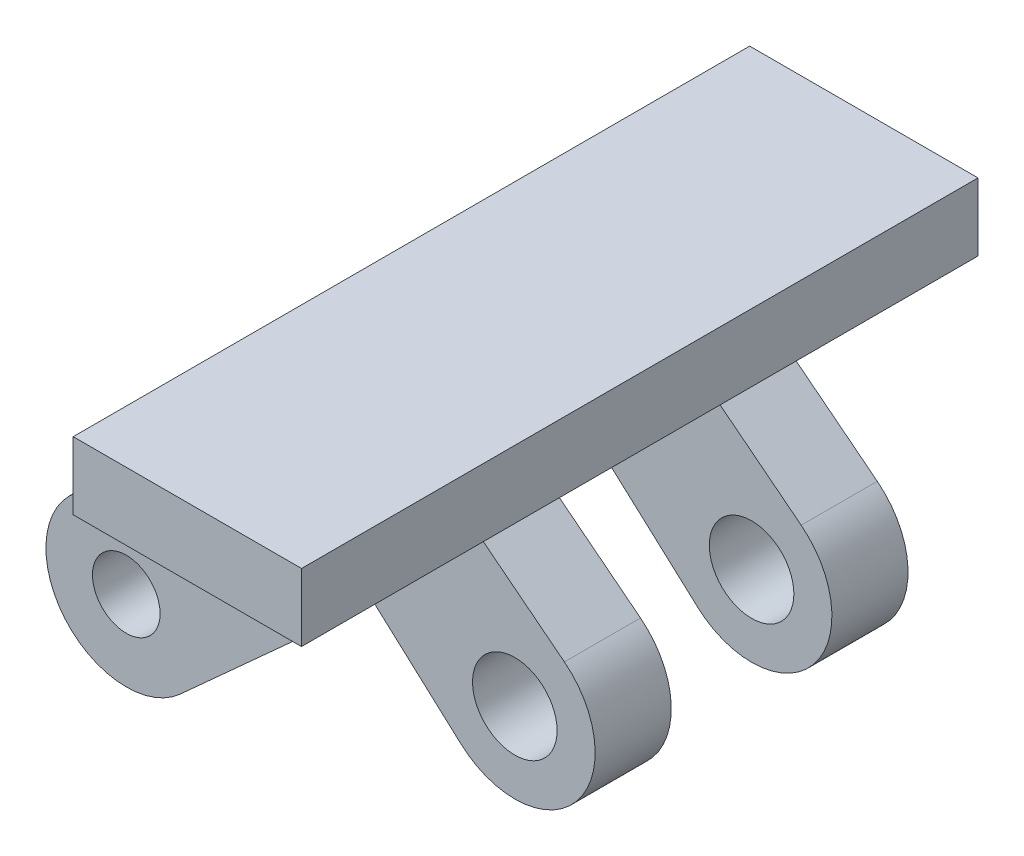
ISO-10303-21;
HEADER;
FILE_DESCRIPTION(('STEP AP214'),'2;1');
FILE_NAME('part.step','',(''),(''),'','','');
FILE_SCHEMA(('AUTOMOTIVE_DESIGN { 1 0 10303 214 1 1 1 1 }'));
ENDSEC;
DATA;
#1=APPLICATION_CONTEXT('core data for automotive mechanical design processes');
#2=APPLICATION_PROTOCOL_DEFINITION('international standard','automotive_design',2000,#1);
#3=PRODUCT_CONTEXT('',#1,'mechanical');
#4=PRODUCT('Part','Part','',(#3));
#5=PRODUCT_RELATED_PRODUCT_CATEGORY('part','',(#4));
#6=PRODUCT_DEFINITION_FORMATION('','',#4);
#7=PRODUCT_DEFINITION_CONTEXT('part definition',#1,'design');
#8=PRODUCT_DEFINITION('design','',#6,#7);
#9=PRODUCT_DEFINITION_SHAPE('','',#8);
#10=(LENGTH_UNIT() NAMED_UNIT(*) SI_UNIT(.MILLI.,.METRE.));
#11=(NAMED_UNIT(*) PLANE_ANGLE_UNIT() SI_UNIT($,.RADIAN.));
#12=(NAMED_UNIT(*) SI_UNIT($,.STERADIAN.) SOLID_ANGLE_UNIT());
#13=UNCERTAINTY_MEASURE_WITH_UNIT(LENGTH_MEASURE(1.E-05),#10,'distance_accuracy_value','');
#14=(GEOMETRIC_REPRESENTATION_CONTEXT(3) GLOBAL_UNCERTAINTY_ASSIGNED_CONTEXT((#13)) GLOBAL_UNIT_ASSIGNED_CONTEXT((#10,
#11,#12)) REPRESENTATION_CONTEXT('',''));
#15=CARTESIAN_POINT('',(0.,0.,0.));
#16=DIRECTION('',(0.,0.,1.));
#17=DIRECTION('',(1.,0.,0.));
#18=AXIS2_PLACEMENT_3D('',#15,#16,#17);
#19=CARTESIAN_POINT('',(0.,-1.6,-8.));
#20=DIRECTION('',(0.,-1.,0.));
#21=DIRECTION('',(0.,0.,-1.));
#22=AXIS2_PLACEMENT_3D('',#19,#20,#21);
#23=PLANE('',#22);
#24=DIRECTION('',(0.,0.,1.));
#25=VECTOR('',#24,1.);
#26=CARTESIAN_POINT('',(0.,-1.6,-8.));
#27=LINE('',#26,#25);
#28=CARTESIAN_POINT('',(0.,-1.6,-1.9));
#29=VERTEX_POINT('',#28);
#30=CARTESIAN_POINT('',(0.,-1.6,1.9));
#31=VERTEX_POINT('',#30);
#32=EDGE_CURVE('E59',#29,#31,#27,.T.);
#33=ORIENTED_EDGE('',*,*,#32,.F.);
#34=DIRECTION('',(1.,0.,0.));
#35=VECTOR('',#34,1.);
#36=CARTESIAN_POINT('',(0.,-1.6,-1.9));
#37=LINE('',#36,#35);
#38=CARTESIAN_POINT('',(5.4,-1.6,-1.9));
#39=VERTEX_POINT('',#38);
#40=EDGE_CURVE('E195',#29,#39,#37,.T.);
#41=ORIENTED_EDGE('',*,*,#40,.T.);
#42=DIRECTION('',(0.,0.,1.));
#43=VECTOR('',#42,1.);
#44=CARTESIAN_POINT('',(5.4,-1.6,-8.));
#45=LINE('',#44,#43);
#46=CARTESIAN_POINT('',(5.4,-1.6,1.9));
#47=VERTEX_POINT('',#46);
#48=EDGE_CURVE('E179',#39,#47,#45,.T.);
#49=ORIENTED_EDGE('',*,*,#48,.T.);
#50=DIRECTION('',(1.,0.,0.));
#51=VECTOR('',#50,1.);
#52=CARTESIAN_POINT('',(0.,-1.6,1.9));
#53=LINE('',#52,#51);
#54=EDGE_CURVE('E284',#31,#47,#53,.T.);
#55=ORIENTED_EDGE('',*,*,#54,.F.);
#56=EDGE_LOOP('',(#33,#41,#49,#55));
#57=FACE_BOUND('',#56,.T.);
#58=ADVANCED_FACE('F41',(#57),#23,.T.);
#59=DIRECTION('',(1.,0.,0.));
#60=VECTOR('',#59,1.);
#61=CARTESIAN_POINT('',(0.,-1.6,-3.7));
#62=LINE('',#61,#60);
#63=CARTESIAN_POINT('',(0.,-1.6,-3.7));
#64=VERTEX_POINT('',#63);
#65=CARTESIAN_POINT('',(5.4,-1.6,-3.7));
#66=VERTEX_POINT('',#65);
#67=EDGE_CURVE('E68',#64,#66,#62,.T.);
#68=ORIENTED_EDGE('',*,*,#67,.F.);
#69=CARTESIAN_POINT('',(0.,-1.6,-4.));
#70=VERTEX_POINT('',#69);
#71=EDGE_CURVE('E379',#70,#64,#27,.T.);
#72=ORIENTED_EDGE('',*,*,#71,.F.);
#73=DIRECTION('',(1.,0.,0.));
#74=VECTOR('',#73,1.);
#75=CARTESIAN_POINT('',(0.,-1.6,-4.));
#76=LINE('',#75,#74);
#77=CARTESIAN_POINT('',(5.4,-1.6,-4.));
#78=VERTEX_POINT('',#77);
#79=EDGE_CURVE('E239',#70,#78,#76,.T.);
#80=ORIENTED_EDGE('',*,*,#79,.T.);
#81=EDGE_CURVE('E189',#78,#66,#45,.T.);
#82=ORIENTED_EDGE('',*,*,#81,.T.);
#83=EDGE_LOOP('',(#68,#72,#80,#82));
#84=FACE_BOUND('',#83,.T.);
#85=ADVANCED_FACE('F430',(#84),#23,.T.);
#86=DIRECTION('',(1.,0.,0.));
#87=VECTOR('',#86,1.);
#88=CARTESIAN_POINT('',(0.,-1.6,-6.));
#89=LINE('',#88,#87);
#90=CARTESIAN_POINT('',(0.,-1.6,-6.));
#91=VERTEX_POINT('',#90);
#92=CARTESIAN_POINT('',(5.4,-1.6,-6.));
#93=VERTEX_POINT('',#92);
#94=EDGE_CURVE('E253',#91,#93,#89,.T.);
#95=ORIENTED_EDGE('',*,*,#94,.F.);
#96=CARTESIAN_POINT('',(0.,-1.6,-8.));
#97=VERTEX_POINT('',#96);
#98=EDGE_CURVE('E44',#97,#91,#27,.T.);
#99=ORIENTED_EDGE('',*,*,#98,.F.);
#100=DIRECTION('',(1.,0.,0.));
#101=VECTOR('',#100,1.);
#102=CARTESIAN_POINT('',(0.,-1.6,-8.));
#103=LINE('',#102,#101);
#104=CARTESIAN_POINT('',(5.4,-1.6,-8.));
#105=VERTEX_POINT('',#104);
#106=EDGE_CURVE('E365',#97,#105,#103,.T.);
#107=ORIENTED_EDGE('',*,*,#106,.T.);
#108=EDGE_CURVE('E188',#105,#93,#45,.T.);
#109=ORIENTED_EDGE('',*,*,#108,.T.);
#110=EDGE_LOOP('',(#95,#99,#107,#109));
#111=FACE_BOUND('',#110,.T.);
#112=ADVANCED_FACE('F435',(#111),#23,.T.);
#113=CARTESIAN_POINT('',(0.,-1.6,6.));
#114=VERTEX_POINT('',#113);
#115=CARTESIAN_POINT('',(0.,-1.6,8.));
#116=VERTEX_POINT('',#115);
#117=EDGE_CURVE('E369',#114,#116,#27,.T.);
#118=ORIENTED_EDGE('',*,*,#117,.F.);
#119=DIRECTION('',(1.,0.,0.));
#120=VECTOR('',#119,1.);
#121=CARTESIAN_POINT('',(0.,-1.6,6.));
#122=LINE('',#121,#120);
#123=CARTESIAN_POINT('',(5.4,-1.6,6.));
#124=VERTEX_POINT('',#123);
#125=EDGE_CURVE('E334',#114,#124,#122,.T.);
#126=ORIENTED_EDGE('',*,*,#125,.T.);
#127=CARTESIAN_POINT('',(5.4,-1.6,8.));
#128=VERTEX_POINT('',#127);
#129=EDGE_CURVE('E373',#124,#128,#45,.T.);
#130=ORIENTED_EDGE('',*,*,#129,.T.);
#131=DIRECTION('',(1.,0.,0.));
#132=VECTOR('',#131,1.);
#133=CARTESIAN_POINT('',(0.,-1.6,8.));
#134=LINE('',#133,#132);
#135=EDGE_CURVE('E349',#116,#128,#134,.T.);
#136=ORIENTED_EDGE('',*,*,#135,.F.);
#137=EDGE_LOOP('',(#118,#126,#130,#136));
#138=FACE_BOUND('',#137,.T.);
#139=ADVANCED_FACE('F413',(#138),#23,.T.);
#140=CARTESIAN_POINT('',(0.,0.,-8.));
#141=DIRECTION('',(-1.,0.,0.));
#142=DIRECTION('',(0.,-1.,0.));
#143=AXIS2_PLACEMENT_3D('',#140,#141,#142);
#144=PLANE('',#143);
#145=ORIENTED_EDGE('',*,*,#98,.T.);
#146=DIRECTION('',(0.,0.,-1.));
#147=VECTOR('',#146,1.);
#148=CARTESIAN_POINT('',(0.,-1.6,-4.));
#149=LINE('',#148,#147);
#150=EDGE_CURVE('E255',#70,#91,#149,.T.);
#151=ORIENTED_EDGE('',*,*,#150,.F.);
#152=ORIENTED_EDGE('',*,*,#71,.T.);
#153=DIRECTION('',(0.,0.,-1.));
#154=VECTOR('',#153,1.);
#155=CARTESIAN_POINT('',(0.,-1.6,-1.9));
#156=LINE('',#155,#154);
#157=EDGE_CURVE('E207',#29,#64,#156,.T.);
#158=ORIENTED_EDGE('',*,*,#157,.F.);
#159=ORIENTED_EDGE('',*,*,#32,.T.);
#160=DIRECTION('',(0.,0.,1.));
#161=VECTOR('',#160,1.);
#162=CARTESIAN_POINT('',(0.,-1.6,1.9));
#163=LINE('',#162,#161);
#164=CARTESIAN_POINT('',(0.,-1.6,3.7));
#165=VERTEX_POINT('',#164);
#166=EDGE_CURVE('E303',#31,#165,#163,.T.);
#167=ORIENTED_EDGE('',*,*,#166,.T.);
#168=CARTESIAN_POINT('',(0.,-1.6,4.));
#169=VERTEX_POINT('',#168);
#170=EDGE_CURVE('E384',#165,#169,#27,.T.);
#171=ORIENTED_EDGE('',*,*,#170,.T.);
#172=DIRECTION('',(0.,0.,1.));
#173=VECTOR('',#172,1.);
#174=CARTESIAN_POINT('',(0.,-1.6,4.));
#175=LINE('',#174,#173);
#176=EDGE_CURVE('E336',#169,#114,#175,.T.);
#177=ORIENTED_EDGE('',*,*,#176,.T.);
#178=ORIENTED_EDGE('',*,*,#117,.T.);
#179=DIRECTION('',(0.,-1.,0.));
#180=VECTOR('',#179,1.);
#181=CARTESIAN_POINT('',(0.,0.,8.));
#182=LINE('',#181,#180);
#183=CARTESIAN_POINT('',(0.,0.,8.));
#184=VERTEX_POINT('',#183);
#185=EDGE_CURVE('E342',#184,#116,#182,.T.);
#186=ORIENTED_EDGE('',*,*,#185,.F.);
#187=DIRECTION('',(0.,0.,1.));
#188=VECTOR('',#187,1.);
#189=CARTESIAN_POINT('',(0.,0.,-8.));
#190=LINE('',#189,#188);
#191=CARTESIAN_POINT('',(0.,0.,-8.));
#192=VERTEX_POINT('',#191);
#193=EDGE_CURVE('E11',#192,#184,#190,.T.);
#194=ORIENTED_EDGE('',*,*,#193,.F.);
#195=DIRECTION('',(0.,-1.,0.));
#196=VECTOR('',#195,1.);
#197=CARTESIAN_POINT('',(0.,0.,-8.));
#198=LINE('',#197,#196);
#199=EDGE_CURVE('E360',#192,#97,#198,.T.);
#200=ORIENTED_EDGE('',*,*,#199,.T.);
#201=EDGE_LOOP('',(#145,#151,#152,#158,#159,#167,#171,#177,#178,#186,#194,#200));
#202=FACE_BOUND('',#201,.T.);
#203=ADVANCED_FACE('F43',(#202),#144,.T.);
#204=CARTESIAN_POINT('',(0.,0.,-8.));
#205=DIRECTION('',(0.,1.,0.));
#206=DIRECTION('',(0.,0.,1.));
#207=AXIS2_PLACEMENT_3D('',#204,#205,#206);
#208=PLANE('',#207);
#209=ORIENTED_EDGE('',*,*,#193,.T.);
#210=DIRECTION('',(-1.,0.,0.));
#211=VECTOR('',#210,1.);
#212=CARTESIAN_POINT('',(0.,0.,8.));
#213=LINE('',#212,#211);
#214=CARTESIAN_POINT('',(5.4,0.,8.));
#215=VERTEX_POINT('',#214);
#216=EDGE_CURVE('E358',#215,#184,#213,.T.);
#217=ORIENTED_EDGE('',*,*,#216,.F.);
#218=DIRECTION('',(0.,0.,1.));
#219=VECTOR('',#218,1.);
#220=CARTESIAN_POINT('',(5.4,0.,-8.));
#221=LINE('',#220,#219);
#222=CARTESIAN_POINT('',(5.4,0.,-8.));
#223=VERTEX_POINT('',#222);
#224=EDGE_CURVE('E49',#223,#215,#221,.T.);
#225=ORIENTED_EDGE('',*,*,#224,.F.);
#226=DIRECTION('',(-1.,0.,0.));
#227=VECTOR('',#226,1.);
#228=CARTESIAN_POINT('',(0.,0.,-8.));
#229=LINE('',#228,#227);
#230=EDGE_CURVE('E368',#223,#192,#229,.T.);
#231=ORIENTED_EDGE('',*,*,#230,.T.);
#232=EDGE_LOOP('',(#209,#217,#225,#231));
#233=FACE_BOUND('',#232,.T.);
#234=ADVANCED_FACE('F443',(#233),#208,.T.);
#235=CARTESIAN_POINT('',(5.4,0.,-8.));
#236=DIRECTION('',(1.,0.,0.));
#237=DIRECTION('',(0.,0.,-1.));
#238=AXIS2_PLACEMENT_3D('',#235,#236,#237);
#239=PLANE('',#238);
#240=ORIENTED_EDGE('',*,*,#224,.T.);
#241=DIRECTION('',(0.,1.,0.));
#242=VECTOR('',#241,1.);
#243=CARTESIAN_POINT('',(5.4,0.,8.));
#244=LINE('',#243,#242);
#245=EDGE_CURVE('E355',#128,#215,#244,.T.);
#246=ORIENTED_EDGE('',*,*,#245,.F.);
#247=ORIENTED_EDGE('',*,*,#129,.F.);
#248=DIRECTION('',(0.,0.,1.));
#249=VECTOR('',#248,1.);
#250=CARTESIAN_POINT('',(5.4,-1.6,4.));
#251=LINE('',#250,#249);
#252=CARTESIAN_POINT('',(5.4,-1.6,4.));
#253=VERTEX_POINT('',#252);
#254=EDGE_CURVE('E345',#253,#124,#251,.T.);
#255=ORIENTED_EDGE('',*,*,#254,.F.);
#256=CARTESIAN_POINT('',(5.4,-1.6,3.7));
#257=VERTEX_POINT('',#256);
#258=EDGE_CURVE('E186',#257,#253,#45,.T.);
#259=ORIENTED_EDGE('',*,*,#258,.F.);
#260=DIRECTION('',(0.,0.,1.));
#261=VECTOR('',#260,1.);
#262=CARTESIAN_POINT('',(5.4,-1.6,1.9));
#263=LINE('',#262,#261);
#264=EDGE_CURVE('E187',#47,#257,#263,.T.);
#265=ORIENTED_EDGE('',*,*,#264,.F.);
#266=ORIENTED_EDGE('',*,*,#48,.F.);
#267=DIRECTION('',(0.,0.,-1.));
#268=VECTOR('',#267,1.);
#269=CARTESIAN_POINT('',(5.4,-1.6,-1.9));
#270=LINE('',#269,#268);
#271=EDGE_CURVE('E182',#39,#66,#270,.T.);
#272=ORIENTED_EDGE('',*,*,#271,.T.);
#273=ORIENTED_EDGE('',*,*,#81,.F.);
#274=DIRECTION('',(0.,0.,-1.));
#275=VECTOR('',#274,1.);
#276=CARTESIAN_POINT('',(5.4,-1.6,-4.));
#277=LINE('',#276,#275);
#278=EDGE_CURVE('E275',#78,#93,#277,.T.);
#279=ORIENTED_EDGE('',*,*,#278,.T.);
#280=ORIENTED_EDGE('',*,*,#108,.F.);
#281=DIRECTION('',(0.,1.,0.));
#282=VECTOR('',#281,1.);
#283=CARTESIAN_POINT('',(5.4,0.,-8.));
#284=LINE('',#283,#282);
#285=EDGE_CURVE('E362',#105,#223,#284,.T.);
#286=ORIENTED_EDGE('',*,*,#285,.T.);
#287=EDGE_LOOP('',(#240,#246,#247,#255,#259,#265,#266,#272,#273,#279,#280,#286));
#288=FACE_BOUND('',#287,.T.);
#289=ADVANCED_FACE('F181',(#288),#239,.T.);
#290=DIRECTION('',(1.,0.,0.));
#291=VECTOR('',#290,1.);
#292=CARTESIAN_POINT('',(0.,-1.6,3.7));
#293=LINE('',#292,#291);
#294=EDGE_CURVE('E299',#165,#257,#293,.T.);
#295=ORIENTED_EDGE('',*,*,#294,.T.);
#296=ORIENTED_EDGE('',*,*,#258,.T.);
#297=DIRECTION('',(1.,0.,0.));
#298=VECTOR('',#297,1.);
#299=CARTESIAN_POINT('',(0.,-1.6,4.));
#300=LINE('',#299,#298);
#301=EDGE_CURVE('E316',#169,#253,#300,.T.);
#302=ORIENTED_EDGE('',*,*,#301,.F.);
#303=ORIENTED_EDGE('',*,*,#170,.F.);
#304=EDGE_LOOP('',(#295,#296,#302,#303));
#305=FACE_BOUND('',#304,.T.);
#306=ADVANCED_FACE('F395',(#305),#23,.T.);
#307=CARTESIAN_POINT('',(0.,0.,-8.));
#308=DIRECTION('',(0.,0.,1.));
#309=DIRECTION('',(1.,0.,0.));
#310=AXIS2_PLACEMENT_3D('',#307,#308,#309);
#311=PLANE('',#310);
#312=ORIENTED_EDGE('',*,*,#199,.F.);
#313=ORIENTED_EDGE('',*,*,#230,.F.);
#314=ORIENTED_EDGE('',*,*,#285,.F.);
#315=ORIENTED_EDGE('',*,*,#106,.F.);
#316=EDGE_LOOP('',(#312,#313,#314,#315));
#317=FACE_BOUND('',#316,.T.);
#318=ADVANCED_FACE('F434',(#317),#311,.F.);
#319=CARTESIAN_POINT('',(0.,0.,8.));
#320=DIRECTION('',(0.,0.,1.));
#321=DIRECTION('',(1.,0.,0.));
#322=AXIS2_PLACEMENT_3D('',#319,#320,#321);
#323=PLANE('',#322);
#324=ORIENTED_EDGE('',*,*,#185,.T.);
#325=ORIENTED_EDGE('',*,*,#135,.T.);
#326=ORIENTED_EDGE('',*,*,#245,.T.);
#327=ORIENTED_EDGE('',*,*,#216,.T.);
#328=EDGE_LOOP('',(#324,#325,#326,#327));
#329=FACE_BOUND('',#328,.T.);
#330=ADVANCED_FACE('F421',(#329),#323,.T.);
#331=CARTESIAN_POINT('',(0.777081399717918,-0.990117064495644,4.));
#332=DIRECTION('',(-0.617395201382569,0.786653141676671,0.));
#333=DIRECTION('',(-0.786653141676671,-0.617395201382569,0.));
#334=AXIS2_PLACEMENT_3D('',#331,#332,#333);
#335=PLANE('',#334);
#336=DIRECTION('',(-0.786653141676672,-0.617395201382569,0.));
#337=VECTOR('',#336,1.);
#338=CARTESIAN_POINT('',(0.777081399717918,-0.990117064495644,6.));
#339=LINE('',#338,#337);
#340=CARTESIAN_POINT('',(-1.91805088262688,-3.10535903081433,6.));
#341=VERTEX_POINT('',#340);
#342=EDGE_CURVE('E304',#114,#341,#339,.T.);
#343=ORIENTED_EDGE('',*,*,#342,.F.);
#344=ORIENTED_EDGE('',*,*,#176,.F.);
#345=DIRECTION('',(-0.786653141676672,-0.617395201382569,0.));
#346=VECTOR('',#345,1.);
#347=CARTESIAN_POINT('',(0.777081399717918,-0.990117064495644,4.));
#348=LINE('',#347,#346);
#349=CARTESIAN_POINT('',(-1.91805088262688,-3.10535903081433,4.));
#350=VERTEX_POINT('',#349);
#351=EDGE_CURVE('E309',#169,#350,#348,.T.);
#352=ORIENTED_EDGE('',*,*,#351,.T.);
#353=DIRECTION('',(0.,0.,1.));
#354=VECTOR('',#353,1.);
#355=CARTESIAN_POINT('',(-1.91805088262688,-3.10535903081433,4.));
#356=LINE('',#355,#354);
#357=EDGE_CURVE('E323',#350,#341,#356,.T.);
#358=ORIENTED_EDGE('',*,*,#357,.T.);
#359=EDGE_LOOP('',(#343,#344,#352,#358));
#360=FACE_BOUND('',#359,.T.);
#361=ADVANCED_FACE('F399',(#360),#335,.T.);
#362=CARTESIAN_POINT('',(3.22823705745536,-3.56603789040044,4.));
#363=DIRECTION('',(-0.671121557689838,0.741347324001352,0.));
#364=DIRECTION('',(-0.741347324001352,-0.671121557689838,0.));
#365=AXIS2_PLACEMENT_3D('',#362,#363,#364);
#366=PLANE('',#365);
#367=DIRECTION('',(-0.741347324001352,-0.671121557689838,0.));
#368=VECTOR('',#367,1.);
#369=CARTESIAN_POINT('',(3.22823705745536,-3.56603789040044,6.));
#370=LINE('',#369,#368);
#371=CARTESIAN_POINT('',(0.530130959610694,-6.00855991560257,6.));
#372=VERTEX_POINT('',#371);
#373=EDGE_CURVE('E333',#124,#372,#370,.T.);
#374=ORIENTED_EDGE('',*,*,#373,.T.);
#375=DIRECTION('',(0.,0.,1.));
#376=VECTOR('',#375,1.);
#377=CARTESIAN_POINT('',(0.530130959610694,-6.00855991560257,4.));
#378=LINE('',#377,#376);
#379=CARTESIAN_POINT('',(0.530130959610694,-6.00855991560257,4.));
#380=VERTEX_POINT('',#379);
#381=EDGE_CURVE('E343',#380,#372,#378,.T.);
#382=ORIENTED_EDGE('',*,*,#381,.F.);
#383=DIRECTION('',(-0.741347324001352,-0.671121557689838,0.));
#384=VECTOR('',#383,1.);
#385=CARTESIAN_POINT('',(3.22823705745536,-3.56603789040044,4.));
#386=LINE('',#385,#384);
#387=EDGE_CURVE('E320',#253,#380,#386,.T.);
#388=ORIENTED_EDGE('',*,*,#387,.F.);
#389=ORIENTED_EDGE('',*,*,#254,.T.);
#390=EDGE_LOOP('',(#374,#382,#388,#389));
#391=FACE_BOUND('',#390,.T.);
#392=ADVANCED_FACE('F412',(#391),#366,.F.);
#393=CARTESIAN_POINT('',(-0.744999999999999,-4.6,4.));
#394=DIRECTION('',(0.,0.,1.));
#395=DIRECTION('',(1.,0.,0.));
#396=AXIS2_PLACEMENT_3D('',#393,#394,#395);
#397=CYLINDRICAL_SURFACE('',#396,1.9);
#398=CARTESIAN_POINT('',(-0.744999999999999,-4.6,6.));
#399=DIRECTION('',(0.,0.,1.));
#400=DIRECTION('',(1.,0.,0.));
#401=AXIS2_PLACEMENT_3D('',#398,#399,#400);
#402=CIRCLE('',#401,1.9);
#403=EDGE_CURVE('E326',#341,#372,#402,.T.);
#404=ORIENTED_EDGE('',*,*,#403,.F.);
#405=ORIENTED_EDGE('',*,*,#357,.F.);
#406=CARTESIAN_POINT('',(-0.744999999999999,-4.6,4.));
#407=DIRECTION('',(0.,0.,1.));
#408=DIRECTION('',(1.,0.,0.));
#409=AXIS2_PLACEMENT_3D('',#406,#407,#408);
#410=CIRCLE('',#409,1.9);
#411=EDGE_CURVE('E312',#350,#380,#410,.T.);
#412=ORIENTED_EDGE('',*,*,#411,.T.);
#413=ORIENTED_EDGE('',*,*,#381,.T.);
#414=EDGE_LOOP('',(#404,#405,#412,#413));
#415=FACE_BOUND('',#414,.T.);
#416=ADVANCED_FACE('F407',(#415),#397,.T.);
#417=CARTESIAN_POINT('',(-0.744999999999999,-4.6,4.));
#418=DIRECTION('',(0.,0.,1.));
#419=DIRECTION('',(1.,0.,0.));
#420=AXIS2_PLACEMENT_3D('',#417,#418,#419);
#421=CYLINDRICAL_SURFACE('',#420,0.8);
#422=CARTESIAN_POINT('',(-0.744999999999999,-4.6,4.));
#423=DIRECTION('',(0.,0.,1.));
#424=DIRECTION('',(1.,0.,0.));
#425=AXIS2_PLACEMENT_3D('',#422,#423,#424);
#426=CIRCLE('',#425,0.8);
#427=CARTESIAN_POINT('',(0.0550000000000011,-4.6,4.));
#428=VERTEX_POINT('',#427);
#429=EDGE_CURVE('E325',#428,#428,#426,.T.);
#430=ORIENTED_EDGE('',*,*,#429,.F.);
#431=EDGE_LOOP('',(#430));
#432=FACE_BOUND('',#431,.T.);
#433=CARTESIAN_POINT('',(-0.744999999999999,-4.6,6.));
#434=DIRECTION('',(0.,0.,1.));
#435=DIRECTION('',(1.,0.,0.));
#436=AXIS2_PLACEMENT_3D('',#433,#434,#435);
#437=CIRCLE('',#436,0.8);
#438=CARTESIAN_POINT('',(0.0550000000000011,-4.6,6.));
#439=VERTEX_POINT('',#438);
#440=EDGE_CURVE('E313',#439,#439,#437,.T.);
#441=ORIENTED_EDGE('',*,*,#440,.T.);
#442=EDGE_LOOP('',(#441));
#443=FACE_BOUND('',#442,.T.);
#444=ADVANCED_FACE('F423',(#432,#443),#421,.F.);
#445=CARTESIAN_POINT('',(0.,0.,4.));
#446=DIRECTION('',(0.,0.,1.));
#447=DIRECTION('',(1.,0.,0.));
#448=AXIS2_PLACEMENT_3D('',#445,#446,#447);
#449=PLANE('',#448);
#450=ORIENTED_EDGE('',*,*,#351,.F.);
#451=ORIENTED_EDGE('',*,*,#301,.T.);
#452=ORIENTED_EDGE('',*,*,#387,.T.);
#453=ORIENTED_EDGE('',*,*,#411,.F.);
#454=EDGE_LOOP('',(#450,#451,#452,#453));
#455=FACE_BOUND('',#454,.T.);
#456=ORIENTED_EDGE('',*,*,#429,.T.);
#457=EDGE_LOOP('',(#456));
#458=FACE_BOUND('',#457,.T.);
#459=ADVANCED_FACE('F402',(#455,#458),#449,.F.);
#460=CARTESIAN_POINT('',(0.,0.,6.));
#461=DIRECTION('',(0.,0.,1.));
#462=DIRECTION('',(1.,0.,0.));
#463=AXIS2_PLACEMENT_3D('',#460,#461,#462);
#464=PLANE('',#463);
#465=ORIENTED_EDGE('',*,*,#342,.T.);
#466=ORIENTED_EDGE('',*,*,#403,.T.);
#467=ORIENTED_EDGE('',*,*,#373,.F.);
#468=ORIENTED_EDGE('',*,*,#125,.F.);
#469=EDGE_LOOP('',(#465,#466,#467,#468));
#470=FACE_BOUND('',#469,.T.);
#471=ORIENTED_EDGE('',*,*,#440,.F.);
#472=EDGE_LOOP('',(#471));
#473=FACE_BOUND('',#472,.T.);
#474=ADVANCED_FACE('F406',(#470,#473),#464,.T.);
#475=CARTESIAN_POINT('',(-0.796054673396768,-0.879353367686345,1.9));
#476=DIRECTION('',(-0.671121557689838,-0.741347324001352,0.));
#477=DIRECTION('',(0.741347324001352,-0.671121557689838,0.));
#478=AXIS2_PLACEMENT_3D('',#475,#476,#477);
#479=PLANE('',#478);
#480=DIRECTION('',(0.741347324001352,-0.671121557689838,0.));
#481=VECTOR('',#480,1.);
#482=CARTESIAN_POINT('',(-0.796054673396768,-0.879353367686345,3.7));
#483=LINE('',#482,#481);
#484=CARTESIAN_POINT('',(4.86986904038931,-6.00855991560257,3.7));
#485=VERTEX_POINT('',#484);
#486=EDGE_CURVE('E269',#165,#485,#483,.T.);
#487=ORIENTED_EDGE('',*,*,#486,.F.);
#488=ORIENTED_EDGE('',*,*,#166,.F.);
#489=DIRECTION('',(0.741347324001352,-0.671121557689838,0.));
#490=VECTOR('',#489,1.);
#491=CARTESIAN_POINT('',(-0.796054673396768,-0.879353367686345,1.9));
#492=LINE('',#491,#490);
#493=CARTESIAN_POINT('',(4.86986904038931,-6.00855991560257,1.9));
#494=VERTEX_POINT('',#493);
#495=EDGE_CURVE('E277',#31,#494,#492,.T.);
#496=ORIENTED_EDGE('',*,*,#495,.T.);
#497=DIRECTION('',(0.,0.,1.));
#498=VECTOR('',#497,1.);
#499=CARTESIAN_POINT('',(4.86986904038931,-6.00855991560257,1.9));
#500=LINE('',#499,#498);
#501=EDGE_CURVE('E287',#494,#485,#500,.T.);
#502=ORIENTED_EDGE('',*,*,#501,.T.);
#503=EDGE_LOOP('',(#487,#488,#496,#502));
#504=FACE_BOUND('',#503,.T.);
#505=ADVANCED_FACE('F518',(#504),#479,.T.);
#506=CARTESIAN_POINT('',(1.28127350760928,1.63253265955233,1.9));
#507=DIRECTION('',(-0.617395201382569,-0.786653141676671,0.));
#508=DIRECTION('',(0.786653141676672,-0.617395201382569,0.));
#509=AXIS2_PLACEMENT_3D('',#506,#507,#508);
#510=PLANE('',#509);
#511=DIRECTION('',(0.786653141676672,-0.617395201382569,0.));
#512=VECTOR('',#511,1.);
#513=CARTESIAN_POINT('',(1.28127350760928,1.63253265955233,3.7));
#514=LINE('',#513,#512);
#515=CARTESIAN_POINT('',(7.31805088262688,-3.10535903081432,3.7));
#516=VERTEX_POINT('',#515);
#517=EDGE_CURVE('E298',#257,#516,#514,.T.);
#518=ORIENTED_EDGE('',*,*,#517,.T.);
#519=DIRECTION('',(0.,0.,1.));
#520=VECTOR('',#519,1.);
#521=CARTESIAN_POINT('',(7.31805088262688,-3.10535903081432,1.9));
#522=LINE('',#521,#520);
#523=CARTESIAN_POINT('',(7.31805088262688,-3.10535903081432,1.9));
#524=VERTEX_POINT('',#523);
#525=EDGE_CURVE('E310',#524,#516,#522,.T.);
#526=ORIENTED_EDGE('',*,*,#525,.F.);
#527=DIRECTION('',(0.786653141676672,-0.617395201382569,0.));
#528=VECTOR('',#527,1.);
#529=CARTESIAN_POINT('',(1.28127350760928,1.63253265955233,1.9));
#530=LINE('',#529,#528);
#531=EDGE_CURVE('E281',#47,#524,#530,.T.);
#532=ORIENTED_EDGE('',*,*,#531,.F.);
#533=ORIENTED_EDGE('',*,*,#264,.T.);
#534=EDGE_LOOP('',(#518,#526,#532,#533));
#535=FACE_BOUND('',#534,.T.);
#536=ADVANCED_FACE('F520',(#535),#510,.F.);
#537=CARTESIAN_POINT('',(6.145,-4.6,1.9));
#538=DIRECTION('',(0.,0.,1.));
#539=DIRECTION('',(1.,0.,0.));
#540=AXIS2_PLACEMENT_3D('',#537,#538,#539);
#541=CYLINDRICAL_SURFACE('',#540,1.9);
#542=CARTESIAN_POINT('',(6.145,-4.6,3.7));
#543=DIRECTION('',(0.,0.,1.));
#544=DIRECTION('',(1.,0.,0.));
#545=AXIS2_PLACEMENT_3D('',#542,#543,#544);
#546=CIRCLE('',#545,1.9);
#547=EDGE_CURVE('E291',#485,#516,#546,.T.);
#548=ORIENTED_EDGE('',*,*,#547,.F.);
#549=ORIENTED_EDGE('',*,*,#501,.F.);
#550=CARTESIAN_POINT('',(6.145,-4.6,1.9));
#551=DIRECTION('',(0.,0.,1.));
#552=DIRECTION('',(1.,0.,0.));
#553=AXIS2_PLACEMENT_3D('',#550,#551,#552);
#554=CIRCLE('',#553,1.9);
#555=EDGE_CURVE('E276',#494,#524,#554,.T.);
#556=ORIENTED_EDGE('',*,*,#555,.T.);
#557=ORIENTED_EDGE('',*,*,#525,.T.);
#558=EDGE_LOOP('',(#548,#549,#556,#557));
#559=FACE_BOUND('',#558,.T.);
#560=ADVANCED_FACE('F513',(#559),#541,.T.);
#561=CARTESIAN_POINT('',(6.145,-4.6,1.9));
#562=DIRECTION('',(0.,0.,1.));
#563=DIRECTION('',(1.,0.,0.));
#564=AXIS2_PLACEMENT_3D('',#561,#562,#563);
#565=CYLINDRICAL_SURFACE('',#564,1.);
#566=CARTESIAN_POINT('',(6.145,-4.6,1.9));
#567=DIRECTION('',(0.,0.,1.));
#568=DIRECTION('',(1.,0.,0.));
#569=AXIS2_PLACEMENT_3D('',#566,#567,#568);
#570=CIRCLE('',#569,1.);
#571=CARTESIAN_POINT('',(7.145,-4.6,1.9));
#572=VERTEX_POINT('',#571);
#573=EDGE_CURVE('E286',#572,#572,#570,.T.);
#574=ORIENTED_EDGE('',*,*,#573,.F.);
#575=EDGE_LOOP('',(#574));
#576=FACE_BOUND('',#575,.T.);
#577=CARTESIAN_POINT('',(6.145,-4.6,3.7));
#578=DIRECTION('',(0.,0.,1.));
#579=DIRECTION('',(1.,0.,0.));
#580=AXIS2_PLACEMENT_3D('',#577,#578,#579);
#581=CIRCLE('',#580,1.);
#582=CARTESIAN_POINT('',(7.145,-4.6,3.7));
#583=VERTEX_POINT('',#582);
#584=EDGE_CURVE('E278',#583,#583,#581,.T.);
#585=ORIENTED_EDGE('',*,*,#584,.T.);
#586=EDGE_LOOP('',(#585));
#587=FACE_BOUND('',#586,.T.);
#588=ADVANCED_FACE('F508',(#576,#587),#565,.F.);
#589=CARTESIAN_POINT('',(0.,0.,1.9));
#590=DIRECTION('',(0.,0.,1.));
#591=DIRECTION('',(1.,0.,0.));
#592=AXIS2_PLACEMENT_3D('',#589,#590,#591);
#593=PLANE('',#592);
#594=ORIENTED_EDGE('',*,*,#495,.F.);
#595=ORIENTED_EDGE('',*,*,#54,.T.);
#596=ORIENTED_EDGE('',*,*,#531,.T.);
#597=ORIENTED_EDGE('',*,*,#555,.F.);
#598=EDGE_LOOP('',(#594,#595,#596,#597));
#599=FACE_BOUND('',#598,.T.);
#600=ORIENTED_EDGE('',*,*,#573,.T.);
#601=EDGE_LOOP('',(#600));
#602=FACE_BOUND('',#601,.T.);
#603=ADVANCED_FACE('F506',(#599,#602),#593,.F.);
#604=CARTESIAN_POINT('',(0.,0.,3.7));
#605=DIRECTION('',(0.,0.,1.));
#606=DIRECTION('',(1.,0.,0.));
#607=AXIS2_PLACEMENT_3D('',#604,#605,#606);
#608=PLANE('',#607);
#609=ORIENTED_EDGE('',*,*,#486,.T.);
#610=ORIENTED_EDGE('',*,*,#547,.T.);
#611=ORIENTED_EDGE('',*,*,#517,.F.);
#612=ORIENTED_EDGE('',*,*,#294,.F.);
#613=EDGE_LOOP('',(#609,#610,#611,#612));
#614=FACE_BOUND('',#613,.T.);
#615=ORIENTED_EDGE('',*,*,#584,.F.);
#616=EDGE_LOOP('',(#615));
#617=FACE_BOUND('',#616,.T.);
#618=ADVANCED_FACE('F504',(#614,#617),#608,.T.);
#619=CARTESIAN_POINT('',(0.777081399717918,-0.990117064495644,-4.));
#620=DIRECTION('',(0.617395201382569,-0.786653141676671,0.));
#621=DIRECTION('',(0.786653141676671,0.617395201382569,0.));
#622=AXIS2_PLACEMENT_3D('',#619,#620,#621);
#623=PLANE('',#622);
#624=DIRECTION('',(-0.786653141676672,-0.617395201382569,0.));
#625=VECTOR('',#624,1.);
#626=CARTESIAN_POINT('',(0.777081399717918,-0.990117064495644,-6.));
#627=LINE('',#626,#625);
#628=CARTESIAN_POINT('',(-1.91805088262688,-3.10535903081433,-6.));
#629=VERTEX_POINT('',#628);
#630=EDGE_CURVE('E231',#91,#629,#627,.T.);
#631=ORIENTED_EDGE('',*,*,#630,.T.);
#632=DIRECTION('',(0.,0.,-1.));
#633=VECTOR('',#632,1.);
#634=CARTESIAN_POINT('',(-1.91805088262688,-3.10535903081433,-4.));
#635=LINE('',#634,#633);
#636=CARTESIAN_POINT('',(-1.91805088262688,-3.10535903081433,-4.));
#637=VERTEX_POINT('',#636);
#638=EDGE_CURVE('E268',#637,#629,#635,.T.);
#639=ORIENTED_EDGE('',*,*,#638,.F.);
#640=DIRECTION('',(-0.786653141676672,-0.617395201382569,0.));
#641=VECTOR('',#640,1.);
#642=CARTESIAN_POINT('',(0.777081399717918,-0.990117064495644,-4.));
#643=LINE('',#642,#641);
#644=EDGE_CURVE('E240',#70,#637,#643,.T.);
#645=ORIENTED_EDGE('',*,*,#644,.F.);
#646=ORIENTED_EDGE('',*,*,#150,.T.);
#647=EDGE_LOOP('',(#631,#639,#645,#646));
#648=FACE_BOUND('',#647,.T.);
#649=ADVANCED_FACE('F459',(#648),#623,.F.);
#650=CARTESIAN_POINT('',(-0.744999999999999,-4.6,-4.));
#651=DIRECTION('',(0.,0.,-1.));
#652=DIRECTION('',(-1.,0.,0.));
#653=AXIS2_PLACEMENT_3D('',#650,#651,#652);
#654=CYLINDRICAL_SURFACE('',#653,1.9);
#655=CARTESIAN_POINT('',(-0.744999999999999,-4.6,-6.));
#656=DIRECTION('',(0.,0.,1.));
#657=DIRECTION('',(1.,0.,0.));
#658=AXIS2_PLACEMENT_3D('',#655,#656,#657);
#659=CIRCLE('',#658,1.9);
#660=CARTESIAN_POINT('',(0.530130959610694,-6.00855991560257,-6.));
#661=VERTEX_POINT('',#660);
#662=EDGE_CURVE('E263',#629,#661,#659,.T.);
#663=ORIENTED_EDGE('',*,*,#662,.T.);
#664=DIRECTION('',(0.,0.,-1.));
#665=VECTOR('',#664,1.);
#666=CARTESIAN_POINT('',(0.530130959610694,-6.00855991560257,-4.));
#667=LINE('',#666,#665);
#668=CARTESIAN_POINT('',(0.530130959610694,-6.00855991560257,-4.));
#669=VERTEX_POINT('',#668);
#670=EDGE_CURVE('E267',#669,#661,#667,.T.);
#671=ORIENTED_EDGE('',*,*,#670,.F.);
#672=CARTESIAN_POINT('',(-0.744999999999999,-4.6,-4.));
#673=DIRECTION('',(0.,0.,1.));
#674=DIRECTION('',(1.,0.,0.));
#675=AXIS2_PLACEMENT_3D('',#672,#673,#674);
#676=CIRCLE('',#675,1.9);
#677=EDGE_CURVE('E250',#637,#669,#676,.T.);
#678=ORIENTED_EDGE('',*,*,#677,.F.);
#679=ORIENTED_EDGE('',*,*,#638,.T.);
#680=EDGE_LOOP('',(#663,#671,#678,#679));
#681=FACE_BOUND('',#680,.T.);
#682=ADVANCED_FACE('F496',(#681),#654,.T.);
#683=CARTESIAN_POINT('',(3.22823705745536,-3.56603789040044,-4.));
#684=DIRECTION('',(0.671121557689838,-0.741347324001352,0.));
#685=DIRECTION('',(0.741347324001352,0.671121557689838,0.));
#686=AXIS2_PLACEMENT_3D('',#683,#684,#685);
#687=PLANE('',#686);
#688=DIRECTION('',(-0.741347324001352,-0.671121557689838,0.));
#689=VECTOR('',#688,1.);
#690=CARTESIAN_POINT('',(3.22823705745536,-3.56603789040044,-6.));
#691=LINE('',#690,#689);
#692=EDGE_CURVE('E259',#93,#661,#691,.T.);
#693=ORIENTED_EDGE('',*,*,#692,.F.);
#694=ORIENTED_EDGE('',*,*,#278,.F.);
#695=DIRECTION('',(-0.741347324001352,-0.671121557689838,0.));
#696=VECTOR('',#695,1.);
#697=CARTESIAN_POINT('',(3.22823705745536,-3.56603789040044,-4.));
#698=LINE('',#697,#696);
#699=EDGE_CURVE('E242',#78,#669,#698,.T.);
#700=ORIENTED_EDGE('',*,*,#699,.T.);
#701=ORIENTED_EDGE('',*,*,#670,.T.);
#702=EDGE_LOOP('',(#693,#694,#700,#701));
#703=FACE_BOUND('',#702,.T.);
#704=ADVANCED_FACE('F494',(#703),#687,.T.);
#705=CARTESIAN_POINT('',(-0.744999999999999,-4.6,-4.));
#706=DIRECTION('',(0.,0.,-1.));
#707=DIRECTION('',(-1.,0.,0.));
#708=AXIS2_PLACEMENT_3D('',#705,#706,#707);
#709=CYLINDRICAL_SURFACE('',#708,0.8);
#710=CARTESIAN_POINT('',(-0.744999999999999,-4.6,-4.));
#711=DIRECTION('',(0.,0.,1.));
#712=DIRECTION('',(1.,0.,0.));
#713=AXIS2_PLACEMENT_3D('',#710,#711,#712);
#714=CIRCLE('',#713,0.8);
#715=CARTESIAN_POINT('',(0.0550000000000011,-4.6,-4.));
#716=VERTEX_POINT('',#715);
#717=EDGE_CURVE('E248',#716,#716,#714,.T.);
#718=ORIENTED_EDGE('',*,*,#717,.T.);
#719=EDGE_LOOP('',(#718));
#720=FACE_BOUND('',#719,.T.);
#721=CARTESIAN_POINT('',(-0.744999999999999,-4.6,-6.));
#722=DIRECTION('',(0.,0.,1.));
#723=DIRECTION('',(1.,0.,0.));
#724=AXIS2_PLACEMENT_3D('',#721,#722,#723);
#725=CIRCLE('',#724,0.8);
#726=CARTESIAN_POINT('',(0.0550000000000011,-4.6,-6.));
#727=VERTEX_POINT('',#726);
#728=EDGE_CURVE('E241',#727,#727,#725,.T.);
#729=ORIENTED_EDGE('',*,*,#728,.F.);
#730=EDGE_LOOP('',(#729));
#731=FACE_BOUND('',#730,.T.);
#732=ADVANCED_FACE('F486',(#720,#731),#709,.F.);
#733=CARTESIAN_POINT('',(0.,0.,-4.));
#734=DIRECTION('',(0.,0.,-1.));
#735=DIRECTION('',(1.,0.,0.));
#736=AXIS2_PLACEMENT_3D('',#733,#734,#735);
#737=PLANE('',#736);
#738=ORIENTED_EDGE('',*,*,#644,.T.);
#739=ORIENTED_EDGE('',*,*,#677,.T.);
#740=ORIENTED_EDGE('',*,*,#699,.F.);
#741=ORIENTED_EDGE('',*,*,#79,.F.);
#742=EDGE_LOOP('',(#738,#739,#740,#741));
#743=FACE_BOUND('',#742,.T.);
#744=ORIENTED_EDGE('',*,*,#717,.F.);
#745=EDGE_LOOP('',(#744));
#746=FACE_BOUND('',#745,.T.);
#747=ADVANCED_FACE('F482',(#743,#746),#737,.F.);
#748=CARTESIAN_POINT('',(0.,0.,-6.));
#749=DIRECTION('',(0.,0.,-1.));
#750=DIRECTION('',(1.,0.,0.));
#751=AXIS2_PLACEMENT_3D('',#748,#749,#750);
#752=PLANE('',#751);
#753=ORIENTED_EDGE('',*,*,#630,.F.);
#754=ORIENTED_EDGE('',*,*,#94,.T.);
#755=ORIENTED_EDGE('',*,*,#692,.T.);
#756=ORIENTED_EDGE('',*,*,#662,.F.);
#757=EDGE_LOOP('',(#753,#754,#755,#756));
#758=FACE_BOUND('',#757,.T.);
#759=ORIENTED_EDGE('',*,*,#728,.T.);
#760=EDGE_LOOP('',(#759));
#761=FACE_BOUND('',#760,.T.);
#762=ADVANCED_FACE('F458',(#758,#761),#752,.T.);
#763=CARTESIAN_POINT('',(-0.796054673396768,-0.879353367686345,-1.9));
#764=DIRECTION('',(0.671121557689838,0.741347324001352,0.));
#765=DIRECTION('',(-0.741347324001352,0.671121557689838,0.));
#766=AXIS2_PLACEMENT_3D('',#763,#764,#765);
#767=PLANE('',#766);
#768=DIRECTION('',(0.741347324001352,-0.671121557689838,0.));
#769=VECTOR('',#768,1.);
#770=CARTESIAN_POINT('',(-0.796054673396768,-0.879353367686345,-3.7));
#771=LINE('',#770,#769);
#772=CARTESIAN_POINT('',(4.86986904038931,-6.00855991560257,-3.7));
#773=VERTEX_POINT('',#772);
#774=EDGE_CURVE('E217',#64,#773,#771,.T.);
#775=ORIENTED_EDGE('',*,*,#774,.T.);
#776=DIRECTION('',(0.,0.,-1.));
#777=VECTOR('',#776,1.);
#778=CARTESIAN_POINT('',(4.86986904038931,-6.00855991560257,-1.9));
#779=LINE('',#778,#777);
#780=CARTESIAN_POINT('',(4.86986904038931,-6.00855991560257,-1.9));
#781=VERTEX_POINT('',#780);
#782=EDGE_CURVE('E229',#781,#773,#779,.T.);
#783=ORIENTED_EDGE('',*,*,#782,.F.);
#784=DIRECTION('',(0.741347324001352,-0.671121557689838,0.));
#785=VECTOR('',#784,1.);
#786=CARTESIAN_POINT('',(-0.796054673396768,-0.879353367686345,-1.9));
#787=LINE('',#786,#785);
#788=EDGE_CURVE('E200',#29,#781,#787,.T.);
#789=ORIENTED_EDGE('',*,*,#788,.F.);
#790=ORIENTED_EDGE('',*,*,#157,.T.);
#791=EDGE_LOOP('',(#775,#783,#789,#790));
#792=FACE_BOUND('',#791,.T.);
#793=ADVANCED_FACE('F467',(#792),#767,.F.);
#794=CARTESIAN_POINT('',(6.145,-4.6,-1.9));
#795=DIRECTION('',(0.,0.,-1.));
#796=DIRECTION('',(-1.,0.,0.));
#797=AXIS2_PLACEMENT_3D('',#794,#795,#796);
#798=CYLINDRICAL_SURFACE('',#797,1.9);
#799=CARTESIAN_POINT('',(6.145,-4.6,-3.7));
#800=DIRECTION('',(0.,0.,1.));
#801=DIRECTION('',(1.,0.,0.));
#802=AXIS2_PLACEMENT_3D('',#799,#800,#801);
#803=CIRCLE('',#802,1.9);
#804=CARTESIAN_POINT('',(7.31805088262688,-3.10535903081432,-3.7));
#805=VERTEX_POINT('',#804);
#806=EDGE_CURVE('E223',#773,#805,#803,.T.);
#807=ORIENTED_EDGE('',*,*,#806,.T.);
#808=DIRECTION('',(0.,0.,-1.));
#809=VECTOR('',#808,1.);
#810=CARTESIAN_POINT('',(7.31805088262688,-3.10535903081432,-1.9));
#811=LINE('',#810,#809);
#812=CARTESIAN_POINT('',(7.31805088262688,-3.10535903081432,-1.9));
#813=VERTEX_POINT('',#812);
#814=EDGE_CURVE('E202',#813,#805,#811,.T.);
#815=ORIENTED_EDGE('',*,*,#814,.F.);
#816=CARTESIAN_POINT('',(6.145,-4.6,-1.9));
#817=DIRECTION('',(0.,0.,1.));
#818=DIRECTION('',(1.,0.,0.));
#819=AXIS2_PLACEMENT_3D('',#816,#817,#818);
#820=CIRCLE('',#819,1.9);
#821=EDGE_CURVE('E208',#781,#813,#820,.T.);
#822=ORIENTED_EDGE('',*,*,#821,.F.);
#823=ORIENTED_EDGE('',*,*,#782,.T.);
#824=EDGE_LOOP('',(#807,#815,#822,#823));
#825=FACE_BOUND('',#824,.T.);
#826=ADVANCED_FACE('F475',(#825),#798,.T.);
#827=CARTESIAN_POINT('',(1.28127350760928,1.63253265955233,-1.9));
#828=DIRECTION('',(0.617395201382569,0.786653141676671,0.));
#829=DIRECTION('',(-0.786653141676672,0.617395201382569,0.));
#830=AXIS2_PLACEMENT_3D('',#827,#828,#829);
#831=PLANE('',#830);
#832=DIRECTION('',(0.786653141676672,-0.617395201382569,0.));
#833=VECTOR('',#832,1.);
#834=CARTESIAN_POINT('',(1.28127350760928,1.63253265955233,-3.7));
#835=LINE('',#834,#833);
#836=EDGE_CURVE('E204',#66,#805,#835,.T.);
#837=ORIENTED_EDGE('',*,*,#836,.F.);
#838=ORIENTED_EDGE('',*,*,#271,.F.);
#839=DIRECTION('',(0.786653141676672,-0.617395201382569,0.));
#840=VECTOR('',#839,1.);
#841=CARTESIAN_POINT('',(1.28127350760928,1.63253265955233,-1.9));
#842=LINE('',#841,#840);
#843=EDGE_CURVE('E198',#39,#813,#842,.T.);
#844=ORIENTED_EDGE('',*,*,#843,.T.);
#845=ORIENTED_EDGE('',*,*,#814,.T.);
#846=EDGE_LOOP('',(#837,#838,#844,#845));
#847=FACE_BOUND('',#846,.T.);
#848=ADVANCED_FACE('F205',(#847),#831,.T.);
#849=CARTESIAN_POINT('',(6.145,-4.6,-1.9));
#850=DIRECTION('',(0.,0.,-1.));
#851=DIRECTION('',(-1.,0.,0.));
#852=AXIS2_PLACEMENT_3D('',#849,#850,#851);
#853=CYLINDRICAL_SURFACE('',#852,1.);
#854=CARTESIAN_POINT('',(6.145,-4.6,-1.9));
#855=DIRECTION('',(0.,0.,1.));
#856=DIRECTION('',(1.,0.,0.));
#857=AXIS2_PLACEMENT_3D('',#854,#855,#856);
#858=CIRCLE('',#857,1.);
#859=CARTESIAN_POINT('',(7.145,-4.6,-1.9));
#860=VERTEX_POINT('',#859);
#861=EDGE_CURVE('E214',#860,#860,#858,.T.);
#862=ORIENTED_EDGE('',*,*,#861,.T.);
#863=EDGE_LOOP('',(#862));
#864=FACE_BOUND('',#863,.T.);
#865=CARTESIAN_POINT('',(6.145,-4.6,-3.7));
#866=DIRECTION('',(0.,0.,1.));
#867=DIRECTION('',(1.,0.,0.));
#868=AXIS2_PLACEMENT_3D('',#865,#866,#867);
#869=CIRCLE('',#868,1.);
#870=CARTESIAN_POINT('',(7.145,-4.6,-3.7));
#871=VERTEX_POINT('',#870);
#872=EDGE_CURVE('E227',#871,#871,#869,.T.);
#873=ORIENTED_EDGE('',*,*,#872,.F.);
#874=EDGE_LOOP('',(#873));
#875=FACE_BOUND('',#874,.T.);
#876=ADVANCED_FACE('F477',(#864,#875),#853,.F.);
#877=CARTESIAN_POINT('',(0.,0.,-1.9));
#878=DIRECTION('',(0.,0.,-1.));
#879=DIRECTION('',(1.,0.,0.));
#880=AXIS2_PLACEMENT_3D('',#877,#878,#879);
#881=PLANE('',#880);
#882=ORIENTED_EDGE('',*,*,#788,.T.);
#883=ORIENTED_EDGE('',*,*,#821,.T.);
#884=ORIENTED_EDGE('',*,*,#843,.F.);
#885=ORIENTED_EDGE('',*,*,#40,.F.);
#886=EDGE_LOOP('',(#882,#883,#884,#885));
#887=FACE_BOUND('',#886,.T.);
#888=ORIENTED_EDGE('',*,*,#861,.F.);
#889=EDGE_LOOP('',(#888));
#890=FACE_BOUND('',#889,.T.);
#891=ADVANCED_FACE('F206',(#887,#890),#881,.F.);
#892=CARTESIAN_POINT('',(0.,0.,-3.7));
#893=DIRECTION('',(0.,0.,-1.));
#894=DIRECTION('',(1.,0.,0.));
#895=AXIS2_PLACEMENT_3D('',#892,#893,#894);
#896=PLANE('',#895);
#897=ORIENTED_EDGE('',*,*,#774,.F.);
#898=ORIENTED_EDGE('',*,*,#67,.T.);
#899=ORIENTED_EDGE('',*,*,#836,.T.);
#900=ORIENTED_EDGE('',*,*,#806,.F.);
#901=EDGE_LOOP('',(#897,#898,#899,#900));
#902=FACE_BOUND('',#901,.T.);
#903=ORIENTED_EDGE('',*,*,#872,.T.);
#904=EDGE_LOOP('',(#903));
#905=FACE_BOUND('',#904,.T.);
#906=ADVANCED_FACE('F469',(#902,#905),#896,.T.);
#907=CLOSED_SHELL('',(#58,#85,#112,#139,#203,#234,#289,#306,#318,#330,#361,#392,#416,#444,#459,
#474,#505,#536,#560,#588,#603,#618,#649,#682,#704,#732,#747,#762,#793,#826,#848,#876,#891,#906));
#908=MANIFOLD_SOLID_BREP('B2',#907);
#909=ADVANCED_BREP_SHAPE_REPRESENTATION('',(#18,#908),#14);
#910=SHAPE_DEFINITION_REPRESENTATION(#9,#909);
ENDSEC;
END-ISO-10303-21;
